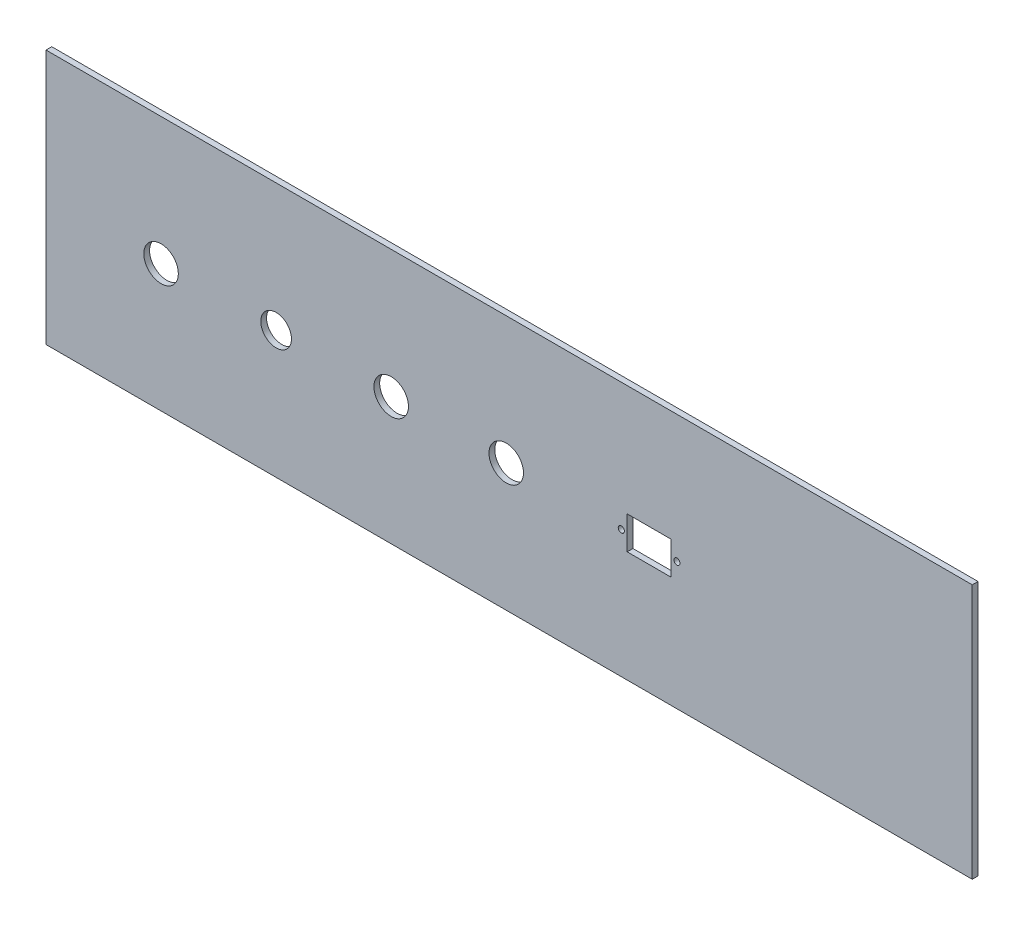
ISO-10303-21;
HEADER;
FILE_DESCRIPTION(('STEP AP214'),'2;1');
FILE_NAME('part.step','',(''),(''),'','','');
FILE_SCHEMA(('AUTOMOTIVE_DESIGN { 1 0 10303 214 1 1 1 1 }'));
ENDSEC;
DATA;
#1=APPLICATION_CONTEXT('core data for automotive mechanical design processes');
#2=APPLICATION_PROTOCOL_DEFINITION('international standard','automotive_design',2000,#1);
#3=PRODUCT_CONTEXT('',#1,'mechanical');
#4=PRODUCT('Part','Part','',(#3));
#5=PRODUCT_RELATED_PRODUCT_CATEGORY('part','',(#4));
#6=PRODUCT_DEFINITION_FORMATION('','',#4);
#7=PRODUCT_DEFINITION_CONTEXT('part definition',#1,'design');
#8=PRODUCT_DEFINITION('design','',#6,#7);
#9=PRODUCT_DEFINITION_SHAPE('','',#8);
#10=(LENGTH_UNIT() NAMED_UNIT(*) SI_UNIT(.MILLI.,.METRE.));
#11=(NAMED_UNIT(*) PLANE_ANGLE_UNIT() SI_UNIT($,.RADIAN.));
#12=(NAMED_UNIT(*) SI_UNIT($,.STERADIAN.) SOLID_ANGLE_UNIT());
#13=UNCERTAINTY_MEASURE_WITH_UNIT(LENGTH_MEASURE(1.E-05),#10,'distance_accuracy_value','');
#14=(GEOMETRIC_REPRESENTATION_CONTEXT(3) GLOBAL_UNCERTAINTY_ASSIGNED_CONTEXT((#13)) GLOBAL_UNIT_ASSIGNED_CONTEXT((#10,
#11,#12)) REPRESENTATION_CONTEXT('',''));
#15=CARTESIAN_POINT('',(0.,0.,0.));
#16=DIRECTION('',(0.,0.,1.));
#17=DIRECTION('',(1.,0.,0.));
#18=AXIS2_PLACEMENT_3D('',#15,#16,#17);
#19=CARTESIAN_POINT('',(0.,0.,3.));
#20=DIRECTION('',(0.,0.,1.));
#21=DIRECTION('',(1.,0.,0.));
#22=AXIS2_PLACEMENT_3D('',#19,#20,#21);
#23=PLANE('',#22);
#24=CARTESIAN_POINT('',(-111.719987767584,53.1200458715596,3.));
#25=DIRECTION('',(0.,0.,1.));
#26=DIRECTION('',(1.,0.,0.));
#27=AXIS2_PLACEMENT_3D('',#24,#25,#26);
#28=CIRCLE('',#27,1.59999999999999);
#29=CARTESIAN_POINT('',(-110.119987767584,53.1200458715596,3.));
#30=VERTEX_POINT('',#29);
#31=EDGE_CURVE('E252',#30,#30,#28,.T.);
#32=ORIENTED_EDGE('',*,*,#31,.F.);
#33=EDGE_LOOP('',(#32));
#34=FACE_BOUND('',#33,.T.);
#35=DIRECTION('',(1.,0.,0.));
#36=VECTOR('',#35,1.);
#37=CARTESIAN_POINT('',(-108.649987767584,44.5450458715596,3.));
#38=LINE('',#37,#36);
#39=CARTESIAN_POINT('',(-108.649987767584,44.5450458715596,3.));
#40=VERTEX_POINT('',#39);
#41=CARTESIAN_POINT('',(-85.7899877675841,44.5450458715596,3.));
#42=VERTEX_POINT('',#41);
#43=EDGE_CURVE('E108',#40,#42,#38,.T.);
#44=ORIENTED_EDGE('',*,*,#43,.F.);
#45=DIRECTION('',(0.,-1.,0.));
#46=VECTOR('',#45,1.);
#47=CARTESIAN_POINT('',(-108.649987767584,61.6950458715596,3.));
#48=LINE('',#47,#46);
#49=CARTESIAN_POINT('',(-108.649987767584,61.6950458715596,3.));
#50=VERTEX_POINT('',#49);
#51=EDGE_CURVE('E100',#50,#40,#48,.T.);
#52=ORIENTED_EDGE('',*,*,#51,.F.);
#53=DIRECTION('',(-1.,0.,0.));
#54=VECTOR('',#53,1.);
#55=CARTESIAN_POINT('',(-108.649987767584,61.6950458715596,3.));
#56=LINE('',#55,#54);
#57=CARTESIAN_POINT('',(-85.7899877675841,61.6950458715596,3.));
#58=VERTEX_POINT('',#57);
#59=EDGE_CURVE('E123',#58,#50,#56,.T.);
#60=ORIENTED_EDGE('',*,*,#59,.F.);
#61=DIRECTION('',(0.,1.,0.));
#62=VECTOR('',#61,1.);
#63=CARTESIAN_POINT('',(-85.7899877675841,61.6950458715596,3.));
#64=LINE('',#63,#62);
#65=EDGE_CURVE('E121',#42,#58,#64,.T.);
#66=ORIENTED_EDGE('',*,*,#65,.F.);
#67=EDGE_LOOP('',(#44,#52,#60,#66));
#68=FACE_BOUND('',#67,.T.);
#69=CARTESIAN_POINT('',(-351.719987767584,53.1300458715596,3.));
#70=DIRECTION('',(0.,0.,1.));
#71=DIRECTION('',(1.,0.,0.));
#72=AXIS2_PLACEMENT_3D('',#69,#70,#71);
#73=CIRCLE('',#72,8.99999999999998);
#74=CARTESIAN_POINT('',(-342.719987767584,53.1300458715596,3.));
#75=VERTEX_POINT('',#74);
#76=EDGE_CURVE('E145',#75,#75,#73,.T.);
#77=ORIENTED_EDGE('',*,*,#76,.F.);
#78=EDGE_LOOP('',(#77));
#79=FACE_BOUND('',#78,.T.);
#80=DIRECTION('',(0.,-1.,0.));
#81=VECTOR('',#80,1.);
#82=CARTESIAN_POINT('',(-411.719987767584,119.63004587156,3.));
#83=LINE('',#82,#81);
#84=CARTESIAN_POINT('',(-411.719987767584,119.63004587156,3.));
#85=VERTEX_POINT('',#84);
#86=CARTESIAN_POINT('',(-411.719987767584,-13.3699541284404,3.));
#87=VERTEX_POINT('',#86);
#88=EDGE_CURVE('E157',#85,#87,#83,.T.);
#89=ORIENTED_EDGE('',*,*,#88,.T.);
#90=DIRECTION('',(1.,0.,0.));
#91=VECTOR('',#90,1.);
#92=CARTESIAN_POINT('',(-411.719987767584,-13.3699541284404,3.));
#93=LINE('',#92,#91);
#94=CARTESIAN_POINT('',(71.2800122324159,-13.3699541284404,3.));
#95=VERTEX_POINT('',#94);
#96=EDGE_CURVE('E160',#87,#95,#93,.T.);
#97=ORIENTED_EDGE('',*,*,#96,.T.);
#98=DIRECTION('',(0.,1.,0.));
#99=VECTOR('',#98,1.);
#100=CARTESIAN_POINT('',(71.2800122324159,119.63004587156,3.));
#101=LINE('',#100,#99);
#102=CARTESIAN_POINT('',(71.2800122324159,119.63004587156,3.));
#103=VERTEX_POINT('',#102);
#104=EDGE_CURVE('E163',#95,#103,#101,.T.);
#105=ORIENTED_EDGE('',*,*,#104,.T.);
#106=DIRECTION('',(-1.,0.,0.));
#107=VECTOR('',#106,1.);
#108=CARTESIAN_POINT('',(-411.719987767584,119.63004587156,3.));
#109=LINE('',#108,#107);
#110=EDGE_CURVE('E165',#103,#85,#109,.T.);
#111=ORIENTED_EDGE('',*,*,#110,.T.);
#112=EDGE_LOOP('',(#89,#97,#105,#111));
#113=FACE_BOUND('',#112,.T.);
#114=CARTESIAN_POINT('',(-291.719987767584,53.1300458715596,3.));
#115=DIRECTION('',(0.,0.,1.));
#116=DIRECTION('',(1.,0.,0.));
#117=AXIS2_PLACEMENT_3D('',#114,#115,#116);
#118=CIRCLE('',#117,7.99999999999998);
#119=CARTESIAN_POINT('',(-283.719987767584,53.1300458715596,3.));
#120=VERTEX_POINT('',#119);
#121=EDGE_CURVE('E151',#120,#120,#118,.T.);
#122=ORIENTED_EDGE('',*,*,#121,.F.);
#123=EDGE_LOOP('',(#122));
#124=FACE_BOUND('',#123,.T.);
#125=CARTESIAN_POINT('',(-231.719987767584,53.1300458715596,3.));
#126=DIRECTION('',(0.,0.,1.));
#127=DIRECTION('',(1.,0.,0.));
#128=AXIS2_PLACEMENT_3D('',#125,#126,#127);
#129=CIRCLE('',#128,8.99999999999998);
#130=CARTESIAN_POINT('',(-222.719987767584,53.1300458715596,3.));
#131=VERTEX_POINT('',#130);
#132=EDGE_CURVE('E139',#131,#131,#129,.T.);
#133=ORIENTED_EDGE('',*,*,#132,.F.);
#134=EDGE_LOOP('',(#133));
#135=FACE_BOUND('',#134,.T.);
#136=CARTESIAN_POINT('',(-171.719987767584,53.1300458715596,3.));
#137=DIRECTION('',(0.,0.,1.));
#138=DIRECTION('',(1.,0.,0.));
#139=AXIS2_PLACEMENT_3D('',#136,#137,#138);
#140=CIRCLE('',#139,9.00000000000001);
#141=CARTESIAN_POINT('',(-162.719987767584,53.1300458715596,3.));
#142=VERTEX_POINT('',#141);
#143=EDGE_CURVE('E129',#142,#142,#140,.T.);
#144=ORIENTED_EDGE('',*,*,#143,.F.);
#145=EDGE_LOOP('',(#144));
#146=FACE_BOUND('',#145,.T.);
#147=CARTESIAN_POINT('',(-82.7199877675841,53.1200458715596,3.));
#148=DIRECTION('',(0.,0.,1.));
#149=DIRECTION('',(1.,0.,0.));
#150=AXIS2_PLACEMENT_3D('',#147,#148,#149);
#151=CIRCLE('',#150,1.60000000000001);
#152=CARTESIAN_POINT('',(-81.1199877675841,53.1200458715596,3.));
#153=VERTEX_POINT('',#152);
#154=EDGE_CURVE('E246',#153,#153,#151,.T.);
#155=ORIENTED_EDGE('',*,*,#154,.F.);
#156=EDGE_LOOP('',(#155));
#157=FACE_BOUND('',#156,.T.);
#158=ADVANCED_FACE('F35',(#34,#68,#79,#113,#124,#135,#146,#157),#23,.T.);
#159=CARTESIAN_POINT('',(0.,0.,0.));
#160=DIRECTION('',(0.,0.,1.));
#161=DIRECTION('',(1.,0.,0.));
#162=AXIS2_PLACEMENT_3D('',#159,#160,#161);
#163=PLANE('',#162);
#164=CARTESIAN_POINT('',(-111.719987767584,53.1200458715596,0.));
#165=DIRECTION('',(0.,0.,1.));
#166=DIRECTION('',(1.,0.,0.));
#167=AXIS2_PLACEMENT_3D('',#164,#165,#166);
#168=CIRCLE('',#167,1.59999999999999);
#169=CARTESIAN_POINT('',(-110.119987767584,53.1200458715596,0.));
#170=VERTEX_POINT('',#169);
#171=EDGE_CURVE('E249',#170,#170,#168,.T.);
#172=ORIENTED_EDGE('',*,*,#171,.T.);
#173=EDGE_LOOP('',(#172));
#174=FACE_BOUND('',#173,.T.);
#175=DIRECTION('',(0.,-1.,0.));
#176=VECTOR('',#175,1.);
#177=CARTESIAN_POINT('',(-108.649987767584,61.6950458715596,0.));
#178=LINE('',#177,#176);
#179=CARTESIAN_POINT('',(-108.649987767584,61.6950458715596,0.));
#180=VERTEX_POINT('',#179);
#181=CARTESIAN_POINT('',(-108.649987767584,44.5450458715596,0.));
#182=VERTEX_POINT('',#181);
#183=EDGE_CURVE('E58',#180,#182,#178,.T.);
#184=ORIENTED_EDGE('',*,*,#183,.T.);
#185=DIRECTION('',(1.,0.,0.));
#186=VECTOR('',#185,1.);
#187=CARTESIAN_POINT('',(-108.649987767584,44.5450458715596,0.));
#188=LINE('',#187,#186);
#189=CARTESIAN_POINT('',(-85.7899877675841,44.5450458715596,0.));
#190=VERTEX_POINT('',#189);
#191=EDGE_CURVE('E115',#182,#190,#188,.T.);
#192=ORIENTED_EDGE('',*,*,#191,.T.);
#193=DIRECTION('',(0.,1.,0.));
#194=VECTOR('',#193,1.);
#195=CARTESIAN_POINT('',(-85.7899877675841,61.6950458715596,0.));
#196=LINE('',#195,#194);
#197=CARTESIAN_POINT('',(-85.7899877675841,61.6950458715596,0.));
#198=VERTEX_POINT('',#197);
#199=EDGE_CURVE('E131',#190,#198,#196,.T.);
#200=ORIENTED_EDGE('',*,*,#199,.T.);
#201=DIRECTION('',(-1.,0.,0.));
#202=VECTOR('',#201,1.);
#203=CARTESIAN_POINT('',(-108.649987767584,61.6950458715596,0.));
#204=LINE('',#203,#202);
#205=EDGE_CURVE('E109',#198,#180,#204,.T.);
#206=ORIENTED_EDGE('',*,*,#205,.T.);
#207=EDGE_LOOP('',(#184,#192,#200,#206));
#208=FACE_BOUND('',#207,.T.);
#209=CARTESIAN_POINT('',(-351.719987767584,53.1300458715596,0.));
#210=DIRECTION('',(0.,0.,1.));
#211=DIRECTION('',(1.,0.,0.));
#212=AXIS2_PLACEMENT_3D('',#209,#210,#211);
#213=CIRCLE('',#212,8.99999999999998);
#214=CARTESIAN_POINT('',(-342.719987767584,53.1300458715596,0.));
#215=VERTEX_POINT('',#214);
#216=EDGE_CURVE('E142',#215,#215,#213,.T.);
#217=ORIENTED_EDGE('',*,*,#216,.T.);
#218=EDGE_LOOP('',(#217));
#219=FACE_BOUND('',#218,.T.);
#220=DIRECTION('',(0.,-1.,0.));
#221=VECTOR('',#220,1.);
#222=CARTESIAN_POINT('',(-411.719987767584,119.63004587156,0.));
#223=LINE('',#222,#221);
#224=CARTESIAN_POINT('',(-411.719987767584,119.63004587156,0.));
#225=VERTEX_POINT('',#224);
#226=CARTESIAN_POINT('',(-411.719987767584,-13.3699541284404,0.));
#227=VERTEX_POINT('',#226);
#228=EDGE_CURVE('E154',#225,#227,#223,.T.);
#229=ORIENTED_EDGE('',*,*,#228,.F.);
#230=DIRECTION('',(-1.,0.,0.));
#231=VECTOR('',#230,1.);
#232=CARTESIAN_POINT('',(-411.719987767584,119.63004587156,0.));
#233=LINE('',#232,#231);
#234=CARTESIAN_POINT('',(71.2800122324159,119.63004587156,0.));
#235=VERTEX_POINT('',#234);
#236=EDGE_CURVE('E161',#235,#225,#233,.T.);
#237=ORIENTED_EDGE('',*,*,#236,.F.);
#238=DIRECTION('',(0.,1.,0.));
#239=VECTOR('',#238,1.);
#240=CARTESIAN_POINT('',(71.2800122324159,119.63004587156,0.));
#241=LINE('',#240,#239);
#242=CARTESIAN_POINT('',(71.2800122324159,-13.3699541284404,0.));
#243=VERTEX_POINT('',#242);
#244=EDGE_CURVE('E172',#243,#235,#241,.T.);
#245=ORIENTED_EDGE('',*,*,#244,.F.);
#246=DIRECTION('',(1.,0.,0.));
#247=VECTOR('',#246,1.);
#248=CARTESIAN_POINT('',(-411.719987767584,-13.3699541284404,0.));
#249=LINE('',#248,#247);
#250=EDGE_CURVE('E170',#227,#243,#249,.T.);
#251=ORIENTED_EDGE('',*,*,#250,.F.);
#252=EDGE_LOOP('',(#229,#237,#245,#251));
#253=FACE_BOUND('',#252,.T.);
#254=CARTESIAN_POINT('',(-291.719987767584,53.1300458715596,0.));
#255=DIRECTION('',(0.,0.,1.));
#256=DIRECTION('',(1.,0.,0.));
#257=AXIS2_PLACEMENT_3D('',#254,#255,#256);
#258=CIRCLE('',#257,7.99999999999998);
#259=CARTESIAN_POINT('',(-283.719987767584,53.1300458715596,0.));
#260=VERTEX_POINT('',#259);
#261=EDGE_CURVE('E148',#260,#260,#258,.T.);
#262=ORIENTED_EDGE('',*,*,#261,.T.);
#263=EDGE_LOOP('',(#262));
#264=FACE_BOUND('',#263,.T.);
#265=CARTESIAN_POINT('',(-231.719987767584,53.1300458715596,0.));
#266=DIRECTION('',(0.,0.,1.));
#267=DIRECTION('',(1.,0.,0.));
#268=AXIS2_PLACEMENT_3D('',#265,#266,#267);
#269=CIRCLE('',#268,8.99999999999998);
#270=CARTESIAN_POINT('',(-222.719987767584,53.1300458715596,0.));
#271=VERTEX_POINT('',#270);
#272=EDGE_CURVE('E116',#271,#271,#269,.T.);
#273=ORIENTED_EDGE('',*,*,#272,.T.);
#274=EDGE_LOOP('',(#273));
#275=FACE_BOUND('',#274,.T.);
#276=CARTESIAN_POINT('',(-171.719987767584,53.1300458715596,0.));
#277=DIRECTION('',(0.,0.,1.));
#278=DIRECTION('',(1.,0.,0.));
#279=AXIS2_PLACEMENT_3D('',#276,#277,#278);
#280=CIRCLE('',#279,9.00000000000001);
#281=CARTESIAN_POINT('',(-162.719987767584,53.1300458715596,0.));
#282=VERTEX_POINT('',#281);
#283=EDGE_CURVE('E241',#282,#282,#280,.T.);
#284=ORIENTED_EDGE('',*,*,#283,.T.);
#285=EDGE_LOOP('',(#284));
#286=FACE_BOUND('',#285,.T.);
#287=CARTESIAN_POINT('',(-82.7199877675841,53.1200458715596,0.));
#288=DIRECTION('',(0.,0.,1.));
#289=DIRECTION('',(1.,0.,0.));
#290=AXIS2_PLACEMENT_3D('',#287,#288,#289);
#291=CIRCLE('',#290,1.60000000000001);
#292=CARTESIAN_POINT('',(-81.1199877675841,53.1200458715596,0.));
#293=VERTEX_POINT('',#292);
#294=EDGE_CURVE('E244',#293,#293,#291,.T.);
#295=ORIENTED_EDGE('',*,*,#294,.T.);
#296=EDGE_LOOP('',(#295));
#297=FACE_BOUND('',#296,.T.);
#298=ADVANCED_FACE('F190',(#174,#208,#219,#253,#264,#275,#286,#297),#163,.F.);
#299=CARTESIAN_POINT('',(-411.719987767584,119.63004587156,3.));
#300=DIRECTION('',(1.,0.,0.));
#301=DIRECTION('',(0.,0.,-1.));
#302=AXIS2_PLACEMENT_3D('',#299,#300,#301);
#303=PLANE('',#302);
#304=ORIENTED_EDGE('',*,*,#228,.T.);
#305=DIRECTION('',(0.,0.,-1.));
#306=VECTOR('',#305,1.);
#307=CARTESIAN_POINT('',(-411.719987767584,-13.3699541284404,3.));
#308=LINE('',#307,#306);
#309=EDGE_CURVE('E11',#87,#227,#308,.T.);
#310=ORIENTED_EDGE('',*,*,#309,.F.);
#311=ORIENTED_EDGE('',*,*,#88,.F.);
#312=DIRECTION('',(0.,0.,-1.));
#313=VECTOR('',#312,1.);
#314=CARTESIAN_POINT('',(-411.719987767584,119.63004587156,3.));
#315=LINE('',#314,#313);
#316=EDGE_CURVE('E167',#85,#225,#315,.T.);
#317=ORIENTED_EDGE('',*,*,#316,.T.);
#318=EDGE_LOOP('',(#304,#310,#311,#317));
#319=FACE_BOUND('',#318,.T.);
#320=ADVANCED_FACE('F37',(#319),#303,.F.);
#321=CARTESIAN_POINT('',(-411.719987767584,-13.3699541284404,3.));
#322=DIRECTION('',(0.,1.,0.));
#323=DIRECTION('',(0.,0.,1.));
#324=AXIS2_PLACEMENT_3D('',#321,#322,#323);
#325=PLANE('',#324);
#326=ORIENTED_EDGE('',*,*,#250,.T.);
#327=DIRECTION('',(0.,0.,-1.));
#328=VECTOR('',#327,1.);
#329=CARTESIAN_POINT('',(71.2800122324159,-13.3699541284404,3.));
#330=LINE('',#329,#328);
#331=EDGE_CURVE('E43',#95,#243,#330,.T.);
#332=ORIENTED_EDGE('',*,*,#331,.F.);
#333=ORIENTED_EDGE('',*,*,#96,.F.);
#334=ORIENTED_EDGE('',*,*,#309,.T.);
#335=EDGE_LOOP('',(#326,#332,#333,#334));
#336=FACE_BOUND('',#335,.T.);
#337=ADVANCED_FACE('F201',(#336),#325,.F.);
#338=CARTESIAN_POINT('',(71.2800122324159,119.63004587156,3.));
#339=DIRECTION('',(-1.,0.,0.));
#340=DIRECTION('',(0.,-1.,0.));
#341=AXIS2_PLACEMENT_3D('',#338,#339,#340);
#342=PLANE('',#341);
#343=ORIENTED_EDGE('',*,*,#244,.T.);
#344=DIRECTION('',(0.,0.,-1.));
#345=VECTOR('',#344,1.);
#346=CARTESIAN_POINT('',(71.2800122324159,119.63004587156,3.));
#347=LINE('',#346,#345);
#348=EDGE_CURVE('E177',#103,#235,#347,.T.);
#349=ORIENTED_EDGE('',*,*,#348,.F.);
#350=ORIENTED_EDGE('',*,*,#104,.F.);
#351=ORIENTED_EDGE('',*,*,#331,.T.);
#352=EDGE_LOOP('',(#343,#349,#350,#351));
#353=FACE_BOUND('',#352,.T.);
#354=ADVANCED_FACE('F184',(#353),#342,.F.);
#355=CARTESIAN_POINT('',(-411.719987767584,119.63004587156,3.));
#356=DIRECTION('',(0.,-1.,0.));
#357=DIRECTION('',(0.,0.,-1.));
#358=AXIS2_PLACEMENT_3D('',#355,#356,#357);
#359=PLANE('',#358);
#360=ORIENTED_EDGE('',*,*,#236,.T.);
#361=ORIENTED_EDGE('',*,*,#316,.F.);
#362=ORIENTED_EDGE('',*,*,#110,.F.);
#363=ORIENTED_EDGE('',*,*,#348,.T.);
#364=EDGE_LOOP('',(#360,#361,#362,#363));
#365=FACE_BOUND('',#364,.T.);
#366=ADVANCED_FACE('F194',(#365),#359,.F.);
#367=CARTESIAN_POINT('',(-291.719987767584,53.1300458715596,3.));
#368=DIRECTION('',(0.,0.,-1.));
#369=DIRECTION('',(-1.,0.,0.));
#370=AXIS2_PLACEMENT_3D('',#367,#368,#369);
#371=CYLINDRICAL_SURFACE('',#370,7.99999999999998);
#372=ORIENTED_EDGE('',*,*,#121,.T.);
#373=EDGE_LOOP('',(#372));
#374=FACE_BOUND('',#373,.T.);
#375=ORIENTED_EDGE('',*,*,#261,.F.);
#376=EDGE_LOOP('',(#375));
#377=FACE_BOUND('',#376,.T.);
#378=ADVANCED_FACE('F218',(#374,#377),#371,.F.);
#379=CARTESIAN_POINT('',(-351.719987767584,53.1300458715596,3.));
#380=DIRECTION('',(0.,0.,-1.));
#381=DIRECTION('',(-1.,0.,0.));
#382=AXIS2_PLACEMENT_3D('',#379,#380,#381);
#383=CYLINDRICAL_SURFACE('',#382,8.99999999999998);
#384=ORIENTED_EDGE('',*,*,#76,.T.);
#385=EDGE_LOOP('',(#384));
#386=FACE_BOUND('',#385,.T.);
#387=ORIENTED_EDGE('',*,*,#216,.F.);
#388=EDGE_LOOP('',(#387));
#389=FACE_BOUND('',#388,.T.);
#390=ADVANCED_FACE('F225',(#386,#389),#383,.F.);
#391=CARTESIAN_POINT('',(-231.719987767584,53.1300458715596,3.));
#392=DIRECTION('',(0.,0.,-1.));
#393=DIRECTION('',(-1.,0.,0.));
#394=AXIS2_PLACEMENT_3D('',#391,#392,#393);
#395=CYLINDRICAL_SURFACE('',#394,8.99999999999998);
#396=ORIENTED_EDGE('',*,*,#132,.T.);
#397=EDGE_LOOP('',(#396));
#398=FACE_BOUND('',#397,.T.);
#399=ORIENTED_EDGE('',*,*,#272,.F.);
#400=EDGE_LOOP('',(#399));
#401=FACE_BOUND('',#400,.T.);
#402=ADVANCED_FACE('F230',(#398,#401),#395,.F.);
#403=CARTESIAN_POINT('',(-108.649987767584,61.6950458715596,3.));
#404=DIRECTION('',(1.,0.,0.));
#405=DIRECTION('',(0.,0.,-1.));
#406=AXIS2_PLACEMENT_3D('',#403,#404,#405);
#407=PLANE('',#406);
#408=ORIENTED_EDGE('',*,*,#183,.F.);
#409=DIRECTION('',(0.,0.,-1.));
#410=VECTOR('',#409,1.);
#411=CARTESIAN_POINT('',(-108.649987767584,61.6950458715596,3.));
#412=LINE('',#411,#410);
#413=EDGE_CURVE('E104',#50,#180,#412,.T.);
#414=ORIENTED_EDGE('',*,*,#413,.F.);
#415=ORIENTED_EDGE('',*,*,#51,.T.);
#416=DIRECTION('',(0.,0.,-1.));
#417=VECTOR('',#416,1.);
#418=CARTESIAN_POINT('',(-108.649987767584,44.5450458715596,3.));
#419=LINE('',#418,#417);
#420=EDGE_CURVE('E103',#40,#182,#419,.T.);
#421=ORIENTED_EDGE('',*,*,#420,.T.);
#422=EDGE_LOOP('',(#408,#414,#415,#421));
#423=FACE_BOUND('',#422,.T.);
#424=ADVANCED_FACE('F102',(#423),#407,.T.);
#425=CARTESIAN_POINT('',(-108.649987767584,44.5450458715596,3.));
#426=DIRECTION('',(0.,1.,0.));
#427=DIRECTION('',(0.,0.,1.));
#428=AXIS2_PLACEMENT_3D('',#425,#426,#427);
#429=PLANE('',#428);
#430=ORIENTED_EDGE('',*,*,#191,.F.);
#431=ORIENTED_EDGE('',*,*,#420,.F.);
#432=ORIENTED_EDGE('',*,*,#43,.T.);
#433=DIRECTION('',(0.,0.,-1.));
#434=VECTOR('',#433,1.);
#435=CARTESIAN_POINT('',(-85.7899877675841,44.5450458715596,3.));
#436=LINE('',#435,#434);
#437=EDGE_CURVE('E117',#42,#190,#436,.T.);
#438=ORIENTED_EDGE('',*,*,#437,.T.);
#439=EDGE_LOOP('',(#430,#431,#432,#438));
#440=FACE_BOUND('',#439,.T.);
#441=ADVANCED_FACE('F112',(#440),#429,.T.);
#442=CARTESIAN_POINT('',(-85.7899877675841,61.6950458715596,3.));
#443=DIRECTION('',(-1.,0.,0.));
#444=DIRECTION('',(0.,0.,1.));
#445=AXIS2_PLACEMENT_3D('',#442,#443,#444);
#446=PLANE('',#445);
#447=ORIENTED_EDGE('',*,*,#199,.F.);
#448=ORIENTED_EDGE('',*,*,#437,.F.);
#449=ORIENTED_EDGE('',*,*,#65,.T.);
#450=DIRECTION('',(0.,0.,-1.));
#451=VECTOR('',#450,1.);
#452=CARTESIAN_POINT('',(-85.7899877675841,61.6950458715596,3.));
#453=LINE('',#452,#451);
#454=EDGE_CURVE('E50',#58,#198,#453,.T.);
#455=ORIENTED_EDGE('',*,*,#454,.T.);
#456=EDGE_LOOP('',(#447,#448,#449,#455));
#457=FACE_BOUND('',#456,.T.);
#458=ADVANCED_FACE('F281',(#457),#446,.T.);
#459=CARTESIAN_POINT('',(-108.649987767584,61.6950458715596,3.));
#460=DIRECTION('',(0.,-1.,0.));
#461=DIRECTION('',(1.,0.,0.));
#462=AXIS2_PLACEMENT_3D('',#459,#460,#461);
#463=PLANE('',#462);
#464=ORIENTED_EDGE('',*,*,#205,.F.);
#465=ORIENTED_EDGE('',*,*,#454,.F.);
#466=ORIENTED_EDGE('',*,*,#59,.T.);
#467=ORIENTED_EDGE('',*,*,#413,.T.);
#468=EDGE_LOOP('',(#464,#465,#466,#467));
#469=FACE_BOUND('',#468,.T.);
#470=ADVANCED_FACE('F278',(#469),#463,.T.);
#471=CARTESIAN_POINT('',(-171.719987767584,53.1300458715596,3.));
#472=DIRECTION('',(0.,0.,-1.));
#473=DIRECTION('',(-1.,0.,0.));
#474=AXIS2_PLACEMENT_3D('',#471,#472,#473);
#475=CYLINDRICAL_SURFACE('',#474,9.00000000000001);
#476=ORIENTED_EDGE('',*,*,#143,.T.);
#477=EDGE_LOOP('',(#476));
#478=FACE_BOUND('',#477,.T.);
#479=ORIENTED_EDGE('',*,*,#283,.F.);
#480=EDGE_LOOP('',(#479));
#481=FACE_BOUND('',#480,.T.);
#482=ADVANCED_FACE('F260',(#478,#481),#475,.F.);
#483=CARTESIAN_POINT('',(-111.719987767584,53.1200458715596,3.));
#484=DIRECTION('',(0.,0.,-1.));
#485=DIRECTION('',(-1.,0.,0.));
#486=AXIS2_PLACEMENT_3D('',#483,#484,#485);
#487=CYLINDRICAL_SURFACE('',#486,1.59999999999999);
#488=ORIENTED_EDGE('',*,*,#31,.T.);
#489=EDGE_LOOP('',(#488));
#490=FACE_BOUND('',#489,.T.);
#491=ORIENTED_EDGE('',*,*,#171,.F.);
#492=EDGE_LOOP('',(#491));
#493=FACE_BOUND('',#492,.T.);
#494=ADVANCED_FACE('F268',(#490,#493),#487,.F.);
#495=CARTESIAN_POINT('',(-82.7199877675841,53.1200458715596,3.));
#496=DIRECTION('',(0.,0.,-1.));
#497=DIRECTION('',(-1.,0.,0.));
#498=AXIS2_PLACEMENT_3D('',#495,#496,#497);
#499=CYLINDRICAL_SURFACE('',#498,1.60000000000001);
#500=ORIENTED_EDGE('',*,*,#154,.T.);
#501=EDGE_LOOP('',(#500));
#502=FACE_BOUND('',#501,.T.);
#503=ORIENTED_EDGE('',*,*,#294,.F.);
#504=EDGE_LOOP('',(#503));
#505=FACE_BOUND('',#504,.T.);
#506=ADVANCED_FACE('F266',(#502,#505),#499,.F.);
#507=CLOSED_SHELL('',(#158,#298,#320,#337,#354,#366,#378,#390,#402,#424,#441,#458,#470,#482,
#494,#506));
#508=MANIFOLD_SOLID_BREP('B2',#507);
#509=ADVANCED_BREP_SHAPE_REPRESENTATION('',(#18,#508),#14);
#510=SHAPE_DEFINITION_REPRESENTATION(#9,#509);
ENDSEC;
END-ISO-10303-21;
